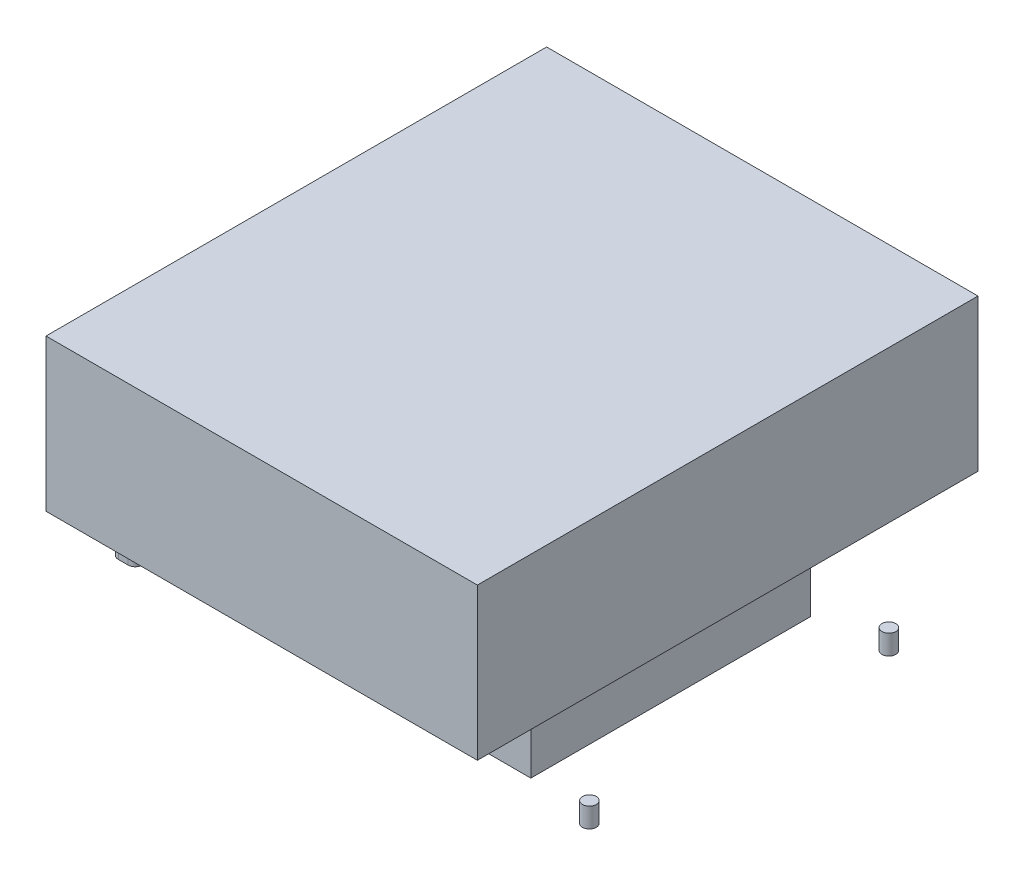
ISO-10303-21;
HEADER;
FILE_DESCRIPTION(('STEP AP214'),'2;1');
FILE_NAME('part.step','',(''),(''),'','','');
FILE_SCHEMA(('AUTOMOTIVE_DESIGN { 1 0 10303 214 1 1 1 1 }'));
ENDSEC;
DATA;
#1=APPLICATION_CONTEXT('core data for automotive mechanical design processes');
#2=APPLICATION_PROTOCOL_DEFINITION('international standard','automotive_design',2000,#1);
#3=PRODUCT_CONTEXT('',#1,'mechanical');
#4=PRODUCT('Part','Part','',(#3));
#5=PRODUCT_RELATED_PRODUCT_CATEGORY('part','',(#4));
#6=PRODUCT_DEFINITION_FORMATION('','',#4);
#7=PRODUCT_DEFINITION_CONTEXT('part definition',#1,'design');
#8=PRODUCT_DEFINITION('design','',#6,#7);
#9=PRODUCT_DEFINITION_SHAPE('','',#8);
#10=(LENGTH_UNIT() NAMED_UNIT(*) SI_UNIT(.MILLI.,.METRE.));
#11=(NAMED_UNIT(*) PLANE_ANGLE_UNIT() SI_UNIT($,.RADIAN.));
#12=(NAMED_UNIT(*) SI_UNIT($,.STERADIAN.) SOLID_ANGLE_UNIT());
#13=UNCERTAINTY_MEASURE_WITH_UNIT(LENGTH_MEASURE(1.E-05),#10,'distance_accuracy_value','');
#14=(GEOMETRIC_REPRESENTATION_CONTEXT(3) GLOBAL_UNCERTAINTY_ASSIGNED_CONTEXT((#13)) GLOBAL_UNIT_ASSIGNED_CONTEXT((#10,
#11,#12)) REPRESENTATION_CONTEXT('',''));
#15=CARTESIAN_POINT('',(0.,0.,0.));
#16=DIRECTION('',(0.,0.,1.));
#17=DIRECTION('',(1.,0.,0.));
#18=AXIS2_PLACEMENT_3D('',#15,#16,#17);
#19=CARTESIAN_POINT('',(114.5,10.,-75.5));
#20=DIRECTION('',(0.,-1.,0.));
#21=DIRECTION('',(0.,0.,-1.));
#22=AXIS2_PLACEMENT_3D('',#19,#20,#21);
#23=CYLINDRICAL_SURFACE('',#22,3.50000000000001);
#24=CARTESIAN_POINT('',(114.5,10.,-75.5));
#25=DIRECTION('',(0.,1.,0.));
#26=DIRECTION('',(0.,0.,1.));
#27=AXIS2_PLACEMENT_3D('',#24,#25,#26);
#28=CIRCLE('',#27,3.50000000000001);
#29=CARTESIAN_POINT('',(114.5,10.,-72.));
#30=VERTEX_POINT('',#29);
#31=EDGE_CURVE('E58',#30,#30,#28,.T.);
#32=ORIENTED_EDGE('',*,*,#31,.F.);
#33=EDGE_LOOP('',(#32));
#34=FACE_BOUND('',#33,.T.);
#35=CARTESIAN_POINT('',(114.5,0.,-75.5));
#36=DIRECTION('',(0.,1.,0.));
#37=DIRECTION('',(0.,0.,1.));
#38=AXIS2_PLACEMENT_3D('',#35,#36,#37);
#39=CIRCLE('',#38,3.50000000000001);
#40=CARTESIAN_POINT('',(114.5,0.,-72.));
#41=VERTEX_POINT('',#40);
#42=EDGE_CURVE('E11',#41,#41,#39,.T.);
#43=ORIENTED_EDGE('',*,*,#42,.T.);
#44=EDGE_LOOP('',(#43));
#45=FACE_BOUND('',#44,.T.);
#46=ADVANCED_FACE('F54',(#34,#45),#23,.T.);
#47=CARTESIAN_POINT('',(114.5,10.,-75.5));
#48=DIRECTION('',(0.,1.,0.));
#49=DIRECTION('',(0.,0.,1.));
#50=AXIS2_PLACEMENT_3D('',#47,#48,#49);
#51=PLANE('',#50);
#52=ORIENTED_EDGE('',*,*,#31,.T.);
#53=EDGE_LOOP('',(#52));
#54=FACE_BOUND('',#53,.T.);
#55=ADVANCED_FACE('F56',(#54),#51,.T.);
#56=CARTESIAN_POINT('',(114.5,0.,-75.5));
#57=DIRECTION('',(0.,1.,0.));
#58=DIRECTION('',(0.,0.,1.));
#59=AXIS2_PLACEMENT_3D('',#56,#57,#58);
#60=PLANE('',#59);
#61=ORIENTED_EDGE('',*,*,#42,.F.);
#62=EDGE_LOOP('',(#61));
#63=FACE_BOUND('',#62,.T.);
#64=ADVANCED_FACE('F73',(#63),#60,.F.);
#65=CLOSED_SHELL('',(#46,#55,#64));
#66=MANIFOLD_SOLID_BREP('B2',#65);
#67=CARTESIAN_POINT('',(114.499999999987,10.,75.5000000000007));
#68=DIRECTION('',(0.,-1.,0.));
#69=DIRECTION('',(0.,0.,-1.));
#70=AXIS2_PLACEMENT_3D('',#67,#68,#69);
#71=CYLINDRICAL_SURFACE('',#70,3.50000000001229);
#72=CARTESIAN_POINT('',(114.499999999987,10.,75.5000000000007));
#73=DIRECTION('',(0.,1.,0.));
#74=DIRECTION('',(0.,0.,1.));
#75=AXIS2_PLACEMENT_3D('',#72,#73,#74);
#76=CIRCLE('',#75,3.50000000001229);
#77=CARTESIAN_POINT('',(114.499999999987,10.,79.000000000013));
#78=VERTEX_POINT('',#77);
#79=EDGE_CURVE('E109',#78,#78,#76,.T.);
#80=ORIENTED_EDGE('',*,*,#79,.F.);
#81=EDGE_LOOP('',(#80));
#82=FACE_BOUND('',#81,.T.);
#83=CARTESIAN_POINT('',(114.499999999987,0.,75.5000000000007));
#84=DIRECTION('',(0.,1.,0.));
#85=DIRECTION('',(0.,0.,1.));
#86=AXIS2_PLACEMENT_3D('',#83,#84,#85);
#87=CIRCLE('',#86,3.50000000001229);
#88=CARTESIAN_POINT('',(114.499999999987,0.,79.000000000013));
#89=VERTEX_POINT('',#88);
#90=EDGE_CURVE('E53',#89,#89,#87,.T.);
#91=ORIENTED_EDGE('',*,*,#90,.T.);
#92=EDGE_LOOP('',(#91));
#93=FACE_BOUND('',#92,.T.);
#94=ADVANCED_FACE('F105',(#82,#93),#71,.T.);
#95=CARTESIAN_POINT('',(0.,10.,0.));
#96=DIRECTION('',(0.,1.,0.));
#97=DIRECTION('',(0.,0.,1.));
#98=AXIS2_PLACEMENT_3D('',#95,#96,#97);
#99=PLANE('',#98);
#100=ORIENTED_EDGE('',*,*,#79,.T.);
#101=EDGE_LOOP('',(#100));
#102=FACE_BOUND('',#101,.T.);
#103=ADVANCED_FACE('F107',(#102),#99,.T.);
#104=CARTESIAN_POINT('',(0.,0.,0.));
#105=DIRECTION('',(0.,1.,0.));
#106=DIRECTION('',(0.,0.,1.));
#107=AXIS2_PLACEMENT_3D('',#104,#105,#106);
#108=PLANE('',#107);
#109=ORIENTED_EDGE('',*,*,#90,.F.);
#110=EDGE_LOOP('',(#109));
#111=FACE_BOUND('',#110,.T.);
#112=ADVANCED_FACE('F124',(#111),#108,.F.);
#113=CLOSED_SHELL('',(#94,#103,#112));
#114=MANIFOLD_SOLID_BREP('B6',#113);
#115=CARTESIAN_POINT('',(-114.499999163765,10.,75.5));
#116=DIRECTION('',(0.,-1.,0.));
#117=DIRECTION('',(0.,0.,-1.));
#118=AXIS2_PLACEMENT_3D('',#115,#116,#117);
#119=CYLINDRICAL_SURFACE('',#118,3.49999999999999);
#120=CARTESIAN_POINT('',(-114.499999163765,0.,75.5));
#121=DIRECTION('',(0.,1.,0.));
#122=DIRECTION('',(0.,0.,1.));
#123=AXIS2_PLACEMENT_3D('',#120,#121,#122);
#124=CIRCLE('',#123,3.49999999999999);
#125=CARTESIAN_POINT('',(-114.499999163765,0.,72.));
#126=VERTEX_POINT('',#125);
#127=CARTESIAN_POINT('',(-114.499999163765,0.,79.));
#128=VERTEX_POINT('',#127);
#129=EDGE_CURVE('E103',#126,#128,#124,.F.);
#130=ORIENTED_EDGE('',*,*,#129,.F.);
#131=DIRECTION('',(0.,-1.,0.));
#132=VECTOR('',#131,1.);
#133=CARTESIAN_POINT('',(-114.499999163765,10.,72.));
#134=LINE('',#133,#132);
#135=CARTESIAN_POINT('',(-114.499999163765,10.,72.));
#136=VERTEX_POINT('',#135);
#137=EDGE_CURVE('E175',#136,#126,#134,.T.);
#138=ORIENTED_EDGE('',*,*,#137,.F.);
#139=CARTESIAN_POINT('',(-114.499999163765,10.,75.5));
#140=DIRECTION('',(0.,1.,0.));
#141=DIRECTION('',(0.,0.,1.));
#142=AXIS2_PLACEMENT_3D('',#139,#140,#141);
#143=CIRCLE('',#142,3.49999999999999);
#144=CARTESIAN_POINT('',(-114.499999163765,10.,79.));
#145=VERTEX_POINT('',#144);
#146=EDGE_CURVE('E160',#136,#145,#143,.F.);
#147=ORIENTED_EDGE('',*,*,#146,.T.);
#148=DIRECTION('',(0.,-1.,0.));
#149=VECTOR('',#148,1.);
#150=CARTESIAN_POINT('',(-114.499999163765,10.,79.));
#151=LINE('',#150,#149);
#152=EDGE_CURVE('E198',#145,#128,#151,.T.);
#153=ORIENTED_EDGE('',*,*,#152,.T.);
#154=EDGE_LOOP('',(#130,#138,#147,#153));
#155=FACE_BOUND('',#154,.T.);
#156=ADVANCED_FACE('F156',(#155),#119,.T.);
#157=CARTESIAN_POINT('',(1.99840144432527E-13,10.,71.9999999999997));
#158=DIRECTION('',(0.,0.,-1.));
#159=DIRECTION('',(-1.,0.,0.));
#160=AXIS2_PLACEMENT_3D('',#157,#158,#159);
#161=PLANE('',#160);
#162=DIRECTION('',(1.,0.,0.));
#163=VECTOR('',#162,1.);
#164=CARTESIAN_POINT('',(1.99840144432527E-13,0.,71.9999999999997));
#165=LINE('',#164,#163);
#166=CARTESIAN_POINT('',(-119.499999163765,0.,72.));
#167=VERTEX_POINT('',#166);
#168=EDGE_CURVE('E166',#167,#126,#165,.T.);
#169=ORIENTED_EDGE('',*,*,#168,.F.);
#170=DIRECTION('',(0.,-1.,0.));
#171=VECTOR('',#170,1.);
#172=CARTESIAN_POINT('',(-119.499999163765,10.,72.));
#173=LINE('',#172,#171);
#174=CARTESIAN_POINT('',(-119.499999163765,10.,72.));
#175=VERTEX_POINT('',#174);
#176=EDGE_CURVE('E189',#175,#167,#173,.T.);
#177=ORIENTED_EDGE('',*,*,#176,.F.);
#178=DIRECTION('',(1.,0.,0.));
#179=VECTOR('',#178,1.);
#180=CARTESIAN_POINT('',(1.99840144432527E-13,10.,71.9999999999997));
#181=LINE('',#180,#179);
#182=EDGE_CURVE('E220',#175,#136,#181,.T.);
#183=ORIENTED_EDGE('',*,*,#182,.T.);
#184=ORIENTED_EDGE('',*,*,#137,.T.);
#185=EDGE_LOOP('',(#169,#177,#183,#184));
#186=FACE_BOUND('',#185,.T.);
#187=ADVANCED_FACE('F227',(#186),#161,.T.);
#188=CARTESIAN_POINT('',(-119.499998974379,10.,75.5000000000007));
#189=DIRECTION('',(0.,-1.,0.));
#190=DIRECTION('',(0.,0.,-1.));
#191=AXIS2_PLACEMENT_3D('',#188,#189,#190);
#192=CYLINDRICAL_SURFACE('',#191,3.5);
#193=CARTESIAN_POINT('',(-119.499998974379,0.,75.5000000000007));
#194=DIRECTION('',(0.,1.,0.));
#195=DIRECTION('',(0.,0.,1.));
#196=AXIS2_PLACEMENT_3D('',#193,#194,#195);
#197=CIRCLE('',#196,3.5);
#198=CARTESIAN_POINT('',(-119.499999163765,0.,79.));
#199=VERTEX_POINT('',#198);
#200=EDGE_CURVE('E204',#167,#199,#197,.T.);
#201=ORIENTED_EDGE('',*,*,#200,.T.);
#202=DIRECTION('',(0.,-1.,0.));
#203=VECTOR('',#202,1.);
#204=CARTESIAN_POINT('',(-119.499999163765,10.,79.));
#205=LINE('',#204,#203);
#206=CARTESIAN_POINT('',(-119.499999163765,10.,79.));
#207=VERTEX_POINT('',#206);
#208=EDGE_CURVE('E207',#207,#199,#205,.T.);
#209=ORIENTED_EDGE('',*,*,#208,.F.);
#210=CARTESIAN_POINT('',(-119.499998974379,10.,75.5000000000007));
#211=DIRECTION('',(0.,1.,0.));
#212=DIRECTION('',(0.,0.,1.));
#213=AXIS2_PLACEMENT_3D('',#210,#211,#212);
#214=CIRCLE('',#213,3.5);
#215=EDGE_CURVE('E225',#175,#207,#214,.T.);
#216=ORIENTED_EDGE('',*,*,#215,.F.);
#217=ORIENTED_EDGE('',*,*,#176,.T.);
#218=EDGE_LOOP('',(#201,#209,#216,#217));
#219=FACE_BOUND('',#218,.T.);
#220=ADVANCED_FACE('F206',(#219),#192,.T.);
#221=CARTESIAN_POINT('',(4.38538094726933E-13,10.,78.9999999999993));
#222=DIRECTION('',(0.,0.,-1.));
#223=DIRECTION('',(-1.,0.,0.));
#224=AXIS2_PLACEMENT_3D('',#221,#222,#223);
#225=PLANE('',#224);
#226=DIRECTION('',(1.,0.,0.));
#227=VECTOR('',#226,1.);
#228=CARTESIAN_POINT('',(4.38538094726933E-13,0.,78.9999999999993));
#229=LINE('',#228,#227);
#230=EDGE_CURVE('E212',#199,#128,#229,.T.);
#231=ORIENTED_EDGE('',*,*,#230,.T.);
#232=ORIENTED_EDGE('',*,*,#152,.F.);
#233=DIRECTION('',(1.,0.,0.));
#234=VECTOR('',#233,1.);
#235=CARTESIAN_POINT('',(4.38538094726933E-13,10.,78.9999999999993));
#236=LINE('',#235,#234);
#237=EDGE_CURVE('E216',#207,#145,#236,.T.);
#238=ORIENTED_EDGE('',*,*,#237,.F.);
#239=ORIENTED_EDGE('',*,*,#208,.T.);
#240=EDGE_LOOP('',(#231,#232,#238,#239));
#241=FACE_BOUND('',#240,.T.);
#242=ADVANCED_FACE('F215',(#241),#225,.F.);
#243=CARTESIAN_POINT('',(0.,10.,0.));
#244=DIRECTION('',(0.,1.,0.));
#245=DIRECTION('',(0.,0.,1.));
#246=AXIS2_PLACEMENT_3D('',#243,#244,#245);
#247=PLANE('',#246);
#248=ORIENTED_EDGE('',*,*,#146,.F.);
#249=ORIENTED_EDGE('',*,*,#182,.F.);
#250=ORIENTED_EDGE('',*,*,#215,.T.);
#251=ORIENTED_EDGE('',*,*,#237,.T.);
#252=EDGE_LOOP('',(#248,#249,#250,#251));
#253=FACE_BOUND('',#252,.T.);
#254=ADVANCED_FACE('F158',(#253),#247,.T.);
#255=CARTESIAN_POINT('',(0.,0.,0.));
#256=DIRECTION('',(0.,1.,0.));
#257=DIRECTION('',(0.,0.,1.));
#258=AXIS2_PLACEMENT_3D('',#255,#256,#257);
#259=PLANE('',#258);
#260=ORIENTED_EDGE('',*,*,#129,.T.);
#261=ORIENTED_EDGE('',*,*,#230,.F.);
#262=ORIENTED_EDGE('',*,*,#200,.F.);
#263=ORIENTED_EDGE('',*,*,#168,.T.);
#264=EDGE_LOOP('',(#260,#261,#262,#263));
#265=FACE_BOUND('',#264,.T.);
#266=ADVANCED_FACE('F218',(#265),#259,.F.);
#267=CLOSED_SHELL('',(#156,#187,#220,#242,#254,#266));
#268=MANIFOLD_SOLID_BREP('B48',#267);
#269=CARTESIAN_POINT('',(-114.5,10.,-75.5000000000007));
#270=DIRECTION('',(0.,-1.,0.));
#271=DIRECTION('',(0.,0.,-1.));
#272=AXIS2_PLACEMENT_3D('',#269,#270,#271);
#273=CYLINDRICAL_SURFACE('',#272,3.49999999999998);
#274=CARTESIAN_POINT('',(-114.5,0.,-75.5000000000007));
#275=DIRECTION('',(0.,1.,0.));
#276=DIRECTION('',(0.,0.,1.));
#277=AXIS2_PLACEMENT_3D('',#274,#275,#276);
#278=CIRCLE('',#277,3.49999999999998);
#279=CARTESIAN_POINT('',(-114.5,0.,-79.0000000000007));
#280=VERTEX_POINT('',#279);
#281=CARTESIAN_POINT('',(-114.5,0.,-72.0000000000007));
#282=VERTEX_POINT('',#281);
#283=EDGE_CURVE('E352',#280,#282,#278,.F.);
#284=ORIENTED_EDGE('',*,*,#283,.F.);
#285=DIRECTION('',(0.,-1.,0.));
#286=VECTOR('',#285,1.);
#287=CARTESIAN_POINT('',(-114.5,10.,-79.0000000000007));
#288=LINE('',#287,#286);
#289=CARTESIAN_POINT('',(-114.5,10.,-79.0000000000007));
#290=VERTEX_POINT('',#289);
#291=EDGE_CURVE('E154',#290,#280,#288,.T.);
#292=ORIENTED_EDGE('',*,*,#291,.F.);
#293=CARTESIAN_POINT('',(-114.5,10.,-75.5000000000007));
#294=DIRECTION('',(0.,1.,0.));
#295=DIRECTION('',(0.,0.,1.));
#296=AXIS2_PLACEMENT_3D('',#293,#294,#295);
#297=CIRCLE('',#296,3.49999999999998);
#298=CARTESIAN_POINT('',(-114.5,10.,-72.0000000000007));
#299=VERTEX_POINT('',#298);
#300=EDGE_CURVE('E346',#290,#299,#297,.F.);
#301=ORIENTED_EDGE('',*,*,#300,.T.);
#302=DIRECTION('',(0.,-1.,0.));
#303=VECTOR('',#302,1.);
#304=CARTESIAN_POINT('',(-114.5,10.,-72.0000000000007));
#305=LINE('',#304,#303);
#306=EDGE_CURVE('E327',#299,#282,#305,.T.);
#307=ORIENTED_EDGE('',*,*,#306,.T.);
#308=EDGE_LOOP('',(#284,#292,#301,#307));
#309=FACE_BOUND('',#308,.T.);
#310=ADVANCED_FACE('F289',(#309),#273,.T.);
#311=CARTESIAN_POINT('',(-2.19269047363471E-13,10.,-79.000000000001));
#312=DIRECTION('',(0.,0.,-1.));
#313=DIRECTION('',(-1.,0.,0.));
#314=AXIS2_PLACEMENT_3D('',#311,#312,#313);
#315=PLANE('',#314);
#316=DIRECTION('',(1.,0.,0.));
#317=VECTOR('',#316,1.);
#318=CARTESIAN_POINT('',(-2.19269047363471E-13,0.,-79.000000000001));
#319=LINE('',#318,#317);
#320=CARTESIAN_POINT('',(-119.5,0.,-79.0000000000006));
#321=VERTEX_POINT('',#320);
#322=EDGE_CURVE('E340',#321,#280,#319,.T.);
#323=ORIENTED_EDGE('',*,*,#322,.F.);
#324=DIRECTION('',(0.,-1.,0.));
#325=VECTOR('',#324,1.);
#326=CARTESIAN_POINT('',(-119.5,10.,-79.0000000000006));
#327=LINE('',#326,#325);
#328=CARTESIAN_POINT('',(-119.5,10.,-79.0000000000006));
#329=VERTEX_POINT('',#328);
#330=EDGE_CURVE('E297',#329,#321,#327,.T.);
#331=ORIENTED_EDGE('',*,*,#330,.F.);
#332=DIRECTION('',(1.,0.,0.));
#333=VECTOR('',#332,1.);
#334=CARTESIAN_POINT('',(-2.19269047363471E-13,10.,-79.000000000001));
#335=LINE('',#334,#333);
#336=EDGE_CURVE('E338',#329,#290,#335,.T.);
#337=ORIENTED_EDGE('',*,*,#336,.T.);
#338=ORIENTED_EDGE('',*,*,#291,.T.);
#339=EDGE_LOOP('',(#323,#331,#337,#338));
#340=FACE_BOUND('',#339,.T.);
#341=ADVANCED_FACE('F336',(#340),#315,.T.);
#342=CARTESIAN_POINT('',(-119.499998138144,10.,-75.5000000000005));
#343=DIRECTION('',(0.,-1.,0.));
#344=DIRECTION('',(0.,0.,-1.));
#345=AXIS2_PLACEMENT_3D('',#342,#343,#344);
#346=CYLINDRICAL_SURFACE('',#345,3.50000000000046);
#347=CARTESIAN_POINT('',(-119.499998138144,0.,-75.5000000000005));
#348=DIRECTION('',(0.,1.,0.));
#349=DIRECTION('',(0.,0.,1.));
#350=AXIS2_PLACEMENT_3D('',#347,#348,#349);
#351=CIRCLE('',#350,3.50000000000046);
#352=CARTESIAN_POINT('',(-119.5,0.,-72.0000000000007));
#353=VERTEX_POINT('',#352);
#354=EDGE_CURVE('E320',#321,#353,#351,.T.);
#355=ORIENTED_EDGE('',*,*,#354,.T.);
#356=DIRECTION('',(0.,-1.,0.));
#357=VECTOR('',#356,1.);
#358=CARTESIAN_POINT('',(-119.5,10.,-72.0000000000007));
#359=LINE('',#358,#357);
#360=CARTESIAN_POINT('',(-119.5,10.,-72.0000000000007));
#361=VERTEX_POINT('',#360);
#362=EDGE_CURVE('E341',#361,#353,#359,.T.);
#363=ORIENTED_EDGE('',*,*,#362,.F.);
#364=CARTESIAN_POINT('',(-119.499998138144,10.,-75.5000000000005));
#365=DIRECTION('',(0.,1.,0.));
#366=DIRECTION('',(0.,0.,1.));
#367=AXIS2_PLACEMENT_3D('',#364,#365,#366);
#368=CIRCLE('',#367,3.50000000000046);
#369=EDGE_CURVE('E342',#329,#361,#368,.T.);
#370=ORIENTED_EDGE('',*,*,#369,.F.);
#371=ORIENTED_EDGE('',*,*,#330,.T.);
#372=EDGE_LOOP('',(#355,#363,#370,#371));
#373=FACE_BOUND('',#372,.T.);
#374=ADVANCED_FACE('F343',(#373),#346,.T.);
#375=CARTESIAN_POINT('',(1.99840144432526E-13,10.,-72.0000000000004));
#376=DIRECTION('',(0.,0.,-1.));
#377=DIRECTION('',(-1.,0.,0.));
#378=AXIS2_PLACEMENT_3D('',#375,#376,#377);
#379=PLANE('',#378);
#380=DIRECTION('',(1.,0.,0.));
#381=VECTOR('',#380,1.);
#382=CARTESIAN_POINT('',(1.99840144432526E-13,0.,-72.0000000000004));
#383=LINE('',#382,#381);
#384=EDGE_CURVE('E348',#353,#282,#383,.T.);
#385=ORIENTED_EDGE('',*,*,#384,.T.);
#386=ORIENTED_EDGE('',*,*,#306,.F.);
#387=DIRECTION('',(1.,0.,0.));
#388=VECTOR('',#387,1.);
#389=CARTESIAN_POINT('',(1.99840144432526E-13,10.,-72.0000000000004));
#390=LINE('',#389,#388);
#391=EDGE_CURVE('E305',#361,#299,#390,.T.);
#392=ORIENTED_EDGE('',*,*,#391,.F.);
#393=ORIENTED_EDGE('',*,*,#362,.T.);
#394=EDGE_LOOP('',(#385,#386,#392,#393));
#395=FACE_BOUND('',#394,.T.);
#396=ADVANCED_FACE('F361',(#395),#379,.F.);
#397=CARTESIAN_POINT('',(0.,10.,0.));
#398=DIRECTION('',(0.,1.,0.));
#399=DIRECTION('',(0.,0.,1.));
#400=AXIS2_PLACEMENT_3D('',#397,#398,#399);
#401=PLANE('',#400);
#402=ORIENTED_EDGE('',*,*,#300,.F.);
#403=ORIENTED_EDGE('',*,*,#336,.F.);
#404=ORIENTED_EDGE('',*,*,#369,.T.);
#405=ORIENTED_EDGE('',*,*,#391,.T.);
#406=EDGE_LOOP('',(#402,#403,#404,#405));
#407=FACE_BOUND('',#406,.T.);
#408=ADVANCED_FACE('F345',(#407),#401,.T.);
#409=CARTESIAN_POINT('',(0.,0.,0.));
#410=DIRECTION('',(0.,1.,0.));
#411=DIRECTION('',(0.,0.,1.));
#412=AXIS2_PLACEMENT_3D('',#409,#410,#411);
#413=PLANE('',#412);
#414=ORIENTED_EDGE('',*,*,#283,.T.);
#415=ORIENTED_EDGE('',*,*,#384,.F.);
#416=ORIENTED_EDGE('',*,*,#354,.F.);
#417=ORIENTED_EDGE('',*,*,#322,.T.);
#418=EDGE_LOOP('',(#414,#415,#416,#417));
#419=FACE_BOUND('',#418,.T.);
#420=ADVANCED_FACE('F363',(#419),#413,.F.);
#421=CLOSED_SHELL('',(#310,#341,#374,#396,#408,#420));
#422=MANIFOLD_SOLID_BREP('B97',#421);
#423=CARTESIAN_POINT('',(0.,50.,70.5));
#424=DIRECTION('',(0.,0.,-1.));
#425=DIRECTION('',(-1.,0.,0.));
#426=AXIS2_PLACEMENT_3D('',#423,#424,#425);
#427=PLANE('',#426);
#428=DIRECTION('',(1.,0.,0.));
#429=VECTOR('',#428,1.);
#430=CARTESIAN_POINT('',(0.,0.,70.5));
#431=LINE('',#430,#429);
#432=CARTESIAN_POINT('',(-80.,0.,70.5));
#433=VERTEX_POINT('',#432);
#434=CARTESIAN_POINT('',(80.,0.,70.5));
#435=VERTEX_POINT('',#434);
#436=EDGE_CURVE('E469',#433,#435,#431,.T.);
#437=ORIENTED_EDGE('',*,*,#436,.T.);
#438=DIRECTION('',(0.,-1.,0.));
#439=VECTOR('',#438,1.);
#440=CARTESIAN_POINT('',(80.,50.,70.5));
#441=LINE('',#440,#439);
#442=CARTESIAN_POINT('',(80.,50.,70.5));
#443=VERTEX_POINT('',#442);
#444=EDGE_CURVE('E287',#443,#435,#441,.T.);
#445=ORIENTED_EDGE('',*,*,#444,.F.);
#446=DIRECTION('',(1.,0.,0.));
#447=VECTOR('',#446,1.);
#448=CARTESIAN_POINT('',(0.,50.,70.5));
#449=LINE('',#448,#447);
#450=CARTESIAN_POINT('',(-80.,50.,70.5));
#451=VERTEX_POINT('',#450);
#452=EDGE_CURVE('E471',#451,#443,#449,.T.);
#453=ORIENTED_EDGE('',*,*,#452,.F.);
#454=DIRECTION('',(0.,-1.,0.));
#455=VECTOR('',#454,1.);
#456=CARTESIAN_POINT('',(-80.,50.,70.5));
#457=LINE('',#456,#455);
#458=EDGE_CURVE('E455',#451,#433,#457,.T.);
#459=ORIENTED_EDGE('',*,*,#458,.T.);
#460=EDGE_LOOP('',(#437,#445,#453,#459));
#461=FACE_BOUND('',#460,.T.);
#462=ADVANCED_FACE('F413',(#461),#427,.F.);
#463=CARTESIAN_POINT('',(80.,50.,0.));
#464=DIRECTION('',(-1.,0.,0.));
#465=DIRECTION('',(0.,0.,1.));
#466=AXIS2_PLACEMENT_3D('',#463,#464,#465);
#467=PLANE('',#466);
#468=DIRECTION('',(0.,0.,-1.));
#469=VECTOR('',#468,1.);
#470=CARTESIAN_POINT('',(80.,0.,0.));
#471=LINE('',#470,#469);
#472=CARTESIAN_POINT('',(80.,0.,-70.5));
#473=VERTEX_POINT('',#472);
#474=EDGE_CURVE('E464',#435,#473,#471,.T.);
#475=ORIENTED_EDGE('',*,*,#474,.T.);
#476=DIRECTION('',(0.,-1.,0.));
#477=VECTOR('',#476,1.);
#478=CARTESIAN_POINT('',(80.,50.,-70.5));
#479=LINE('',#478,#477);
#480=CARTESIAN_POINT('',(80.,50.,-70.5));
#481=VERTEX_POINT('',#480);
#482=EDGE_CURVE('E422',#481,#473,#479,.T.);
#483=ORIENTED_EDGE('',*,*,#482,.F.);
#484=DIRECTION('',(0.,0.,-1.));
#485=VECTOR('',#484,1.);
#486=CARTESIAN_POINT('',(80.,50.,0.));
#487=LINE('',#486,#485);
#488=EDGE_CURVE('E475',#443,#481,#487,.T.);
#489=ORIENTED_EDGE('',*,*,#488,.F.);
#490=ORIENTED_EDGE('',*,*,#444,.T.);
#491=EDGE_LOOP('',(#475,#483,#489,#490));
#492=FACE_BOUND('',#491,.T.);
#493=ADVANCED_FACE('F495',(#492),#467,.F.);
#494=CARTESIAN_POINT('',(0.,50.,-70.5));
#495=DIRECTION('',(0.,0.,-1.));
#496=DIRECTION('',(-1.,0.,0.));
#497=AXIS2_PLACEMENT_3D('',#494,#495,#496);
#498=PLANE('',#497);
#499=DIRECTION('',(1.,0.,0.));
#500=VECTOR('',#499,1.);
#501=CARTESIAN_POINT('',(0.,0.,-70.5));
#502=LINE('',#501,#500);
#503=CARTESIAN_POINT('',(-80.,0.,-70.5));
#504=VERTEX_POINT('',#503);
#505=EDGE_CURVE('E458',#504,#473,#502,.T.);
#506=ORIENTED_EDGE('',*,*,#505,.F.);
#507=DIRECTION('',(0.,-1.,0.));
#508=VECTOR('',#507,1.);
#509=CARTESIAN_POINT('',(-80.,50.,-70.5));
#510=LINE('',#509,#508);
#511=CARTESIAN_POINT('',(-80.,50.,-70.5));
#512=VERTEX_POINT('',#511);
#513=EDGE_CURVE('E446',#512,#504,#510,.T.);
#514=ORIENTED_EDGE('',*,*,#513,.F.);
#515=DIRECTION('',(1.,0.,0.));
#516=VECTOR('',#515,1.);
#517=CARTESIAN_POINT('',(0.,50.,-70.5));
#518=LINE('',#517,#516);
#519=EDGE_CURVE('E429',#512,#481,#518,.T.);
#520=ORIENTED_EDGE('',*,*,#519,.T.);
#521=ORIENTED_EDGE('',*,*,#482,.T.);
#522=EDGE_LOOP('',(#506,#514,#520,#521));
#523=FACE_BOUND('',#522,.T.);
#524=ADVANCED_FACE('F459',(#523),#498,.T.);
#525=CARTESIAN_POINT('',(-80.,50.,0.));
#526=DIRECTION('',(-1.,0.,0.));
#527=DIRECTION('',(0.,0.,1.));
#528=AXIS2_PLACEMENT_3D('',#525,#526,#527);
#529=PLANE('',#528);
#530=DIRECTION('',(0.,0.,-1.));
#531=VECTOR('',#530,1.);
#532=CARTESIAN_POINT('',(-80.,0.,0.));
#533=LINE('',#532,#531);
#534=EDGE_CURVE('E451',#433,#504,#533,.T.);
#535=ORIENTED_EDGE('',*,*,#534,.F.);
#536=ORIENTED_EDGE('',*,*,#458,.F.);
#537=DIRECTION('',(0.,0.,-1.));
#538=VECTOR('',#537,1.);
#539=CARTESIAN_POINT('',(-80.,50.,0.));
#540=LINE('',#539,#538);
#541=EDGE_CURVE('E452',#451,#512,#540,.T.);
#542=ORIENTED_EDGE('',*,*,#541,.T.);
#543=ORIENTED_EDGE('',*,*,#513,.T.);
#544=EDGE_LOOP('',(#535,#536,#542,#543));
#545=FACE_BOUND('',#544,.T.);
#546=ADVANCED_FACE('F448',(#545),#529,.T.);
#547=CARTESIAN_POINT('',(0.,0.,0.));
#548=DIRECTION('',(0.,1.,0.));
#549=DIRECTION('',(0.,0.,1.));
#550=AXIS2_PLACEMENT_3D('',#547,#548,#549);
#551=PLANE('',#550);
#552=ORIENTED_EDGE('',*,*,#436,.F.);
#553=ORIENTED_EDGE('',*,*,#534,.T.);
#554=ORIENTED_EDGE('',*,*,#505,.T.);
#555=ORIENTED_EDGE('',*,*,#474,.F.);
#556=EDGE_LOOP('',(#552,#553,#554,#555));
#557=FACE_BOUND('',#556,.T.);
#558=ADVANCED_FACE('F467',(#557),#551,.F.);
#559=CARTESIAN_POINT('',(0.,50.,0.));
#560=DIRECTION('',(0.,1.,0.));
#561=DIRECTION('',(0.,0.,1.));
#562=AXIS2_PLACEMENT_3D('',#559,#560,#561);
#563=PLANE('',#562);
#564=DIRECTION('',(-1.,0.,0.));
#565=VECTOR('',#564,1.);
#566=CARTESIAN_POINT('',(0.,50.,-126.20625));
#567=LINE('',#566,#565);
#568=CARTESIAN_POINT('',(108.74375,50.,-126.20625));
#569=VERTEX_POINT('',#568);
#570=CARTESIAN_POINT('',(-108.74375,50.,-126.20625));
#571=VERTEX_POINT('',#570);
#572=EDGE_CURVE('E553',#569,#571,#567,.T.);
#573=ORIENTED_EDGE('',*,*,#572,.F.);
#574=DIRECTION('',(0.,0.,1.));
#575=VECTOR('',#574,1.);
#576=CARTESIAN_POINT('',(108.74375,50.,0.));
#577=LINE('',#576,#575);
#578=CARTESIAN_POINT('',(108.74375,50.,126.20625));
#579=VERTEX_POINT('',#578);
#580=EDGE_CURVE('E549',#569,#579,#577,.T.);
#581=ORIENTED_EDGE('',*,*,#580,.T.);
#582=DIRECTION('',(-1.,0.,0.));
#583=VECTOR('',#582,1.);
#584=CARTESIAN_POINT('',(0.,50.,126.20625));
#585=LINE('',#584,#583);
#586=CARTESIAN_POINT('',(-108.74375,50.,126.20625));
#587=VERTEX_POINT('',#586);
#588=EDGE_CURVE('E567',#579,#587,#585,.T.);
#589=ORIENTED_EDGE('',*,*,#588,.T.);
#590=DIRECTION('',(0.,0.,1.));
#591=VECTOR('',#590,1.);
#592=CARTESIAN_POINT('',(-108.74375,50.,0.));
#593=LINE('',#592,#591);
#594=EDGE_CURVE('E571',#571,#587,#593,.T.);
#595=ORIENTED_EDGE('',*,*,#594,.F.);
#596=EDGE_LOOP('',(#573,#581,#589,#595));
#597=FACE_BOUND('',#596,.T.);
#598=ORIENTED_EDGE('',*,*,#541,.F.);
#599=ORIENTED_EDGE('',*,*,#452,.T.);
#600=ORIENTED_EDGE('',*,*,#488,.T.);
#601=ORIENTED_EDGE('',*,*,#519,.F.);
#602=EDGE_LOOP('',(#598,#599,#600,#601));
#603=FACE_BOUND('',#602,.T.);
#604=ADVANCED_FACE('F586',(#597,#603),#563,.F.);
#605=CARTESIAN_POINT('',(0.,126.5302,-126.20625));
#606=DIRECTION('',(0.,0.,1.));
#607=DIRECTION('',(1.,0.,0.));
#608=AXIS2_PLACEMENT_3D('',#605,#606,#607);
#609=PLANE('',#608);
#610=ORIENTED_EDGE('',*,*,#572,.T.);
#611=DIRECTION('',(0.,-1.,0.));
#612=VECTOR('',#611,1.);
#613=CARTESIAN_POINT('',(-108.74375,126.5302,-126.20625));
#614=LINE('',#613,#612);
#615=CARTESIAN_POINT('',(-108.74375,126.5302,-126.20625));
#616=VERTEX_POINT('',#615);
#617=EDGE_CURVE('E492',#616,#571,#614,.T.);
#618=ORIENTED_EDGE('',*,*,#617,.F.);
#619=DIRECTION('',(-1.,0.,0.));
#620=VECTOR('',#619,1.);
#621=CARTESIAN_POINT('',(0.,126.5302,-126.20625));
#622=LINE('',#621,#620);
#623=CARTESIAN_POINT('',(108.74375,126.5302,-126.20625));
#624=VERTEX_POINT('',#623);
#625=EDGE_CURVE('E540',#624,#616,#622,.T.);
#626=ORIENTED_EDGE('',*,*,#625,.F.);
#627=DIRECTION('',(0.,-1.,0.));
#628=VECTOR('',#627,1.);
#629=CARTESIAN_POINT('',(108.74375,126.5302,-126.20625));
#630=LINE('',#629,#628);
#631=EDGE_CURVE('E561',#624,#569,#630,.T.);
#632=ORIENTED_EDGE('',*,*,#631,.T.);
#633=EDGE_LOOP('',(#610,#618,#626,#632));
#634=FACE_BOUND('',#633,.T.);
#635=ADVANCED_FACE('F551',(#634),#609,.F.);
#636=CARTESIAN_POINT('',(-108.74375,126.5302,0.));
#637=DIRECTION('',(1.,0.,0.));
#638=DIRECTION('',(0.,0.,-1.));
#639=AXIS2_PLACEMENT_3D('',#636,#637,#638);
#640=PLANE('',#639);
#641=ORIENTED_EDGE('',*,*,#594,.T.);
#642=DIRECTION('',(0.,-1.,0.));
#643=VECTOR('',#642,1.);
#644=CARTESIAN_POINT('',(-108.74375,126.5302,126.20625));
#645=LINE('',#644,#643);
#646=CARTESIAN_POINT('',(-108.74375,126.5302,126.20625));
#647=VERTEX_POINT('',#646);
#648=EDGE_CURVE('E534',#647,#587,#645,.T.);
#649=ORIENTED_EDGE('',*,*,#648,.F.);
#650=DIRECTION('',(0.,0.,1.));
#651=VECTOR('',#650,1.);
#652=CARTESIAN_POINT('',(-108.74375,126.5302,0.));
#653=LINE('',#652,#651);
#654=EDGE_CURVE('E528',#616,#647,#653,.T.);
#655=ORIENTED_EDGE('',*,*,#654,.F.);
#656=ORIENTED_EDGE('',*,*,#617,.T.);
#657=EDGE_LOOP('',(#641,#649,#655,#656));
#658=FACE_BOUND('',#657,.T.);
#659=ADVANCED_FACE('F531',(#658),#640,.F.);
#660=CARTESIAN_POINT('',(0.,126.5302,126.20625));
#661=DIRECTION('',(0.,0.,1.));
#662=DIRECTION('',(1.,0.,0.));
#663=AXIS2_PLACEMENT_3D('',#660,#661,#662);
#664=PLANE('',#663);
#665=ORIENTED_EDGE('',*,*,#588,.F.);
#666=DIRECTION('',(0.,-1.,0.));
#667=VECTOR('',#666,1.);
#668=CARTESIAN_POINT('',(108.74375,126.5302,126.20625));
#669=LINE('',#668,#667);
#670=CARTESIAN_POINT('',(108.74375,126.5302,126.20625));
#671=VERTEX_POINT('',#670);
#672=EDGE_CURVE('E556',#671,#579,#669,.T.);
#673=ORIENTED_EDGE('',*,*,#672,.F.);
#674=DIRECTION('',(-1.,0.,0.));
#675=VECTOR('',#674,1.);
#676=CARTESIAN_POINT('',(0.,126.5302,126.20625));
#677=LINE('',#676,#675);
#678=EDGE_CURVE('E539',#671,#647,#677,.T.);
#679=ORIENTED_EDGE('',*,*,#678,.T.);
#680=ORIENTED_EDGE('',*,*,#648,.T.);
#681=EDGE_LOOP('',(#665,#673,#679,#680));
#682=FACE_BOUND('',#681,.T.);
#683=ADVANCED_FACE('F581',(#682),#664,.T.);
#684=CARTESIAN_POINT('',(108.74375,126.5302,0.));
#685=DIRECTION('',(1.,0.,0.));
#686=DIRECTION('',(0.,0.,-1.));
#687=AXIS2_PLACEMENT_3D('',#684,#685,#686);
#688=PLANE('',#687);
#689=ORIENTED_EDGE('',*,*,#580,.F.);
#690=ORIENTED_EDGE('',*,*,#631,.F.);
#691=DIRECTION('',(0.,0.,1.));
#692=VECTOR('',#691,1.);
#693=CARTESIAN_POINT('',(108.74375,126.5302,0.));
#694=LINE('',#693,#692);
#695=EDGE_CURVE('E546',#624,#671,#694,.T.);
#696=ORIENTED_EDGE('',*,*,#695,.T.);
#697=ORIENTED_EDGE('',*,*,#672,.T.);
#698=EDGE_LOOP('',(#689,#690,#696,#697));
#699=FACE_BOUND('',#698,.T.);
#700=ADVANCED_FACE('F584',(#699),#688,.T.);
#701=CARTESIAN_POINT('',(0.,126.5302,0.));
#702=DIRECTION('',(0.,1.,0.));
#703=DIRECTION('',(0.,0.,1.));
#704=AXIS2_PLACEMENT_3D('',#701,#702,#703);
#705=PLANE('',#704);
#706=ORIENTED_EDGE('',*,*,#625,.T.);
#707=ORIENTED_EDGE('',*,*,#654,.T.);
#708=ORIENTED_EDGE('',*,*,#678,.F.);
#709=ORIENTED_EDGE('',*,*,#695,.F.);
#710=EDGE_LOOP('',(#706,#707,#708,#709));
#711=FACE_BOUND('',#710,.T.);
#712=ADVANCED_FACE('F544',(#711),#705,.T.);
#713=CLOSED_SHELL('',(#462,#493,#524,#546,#558,#604,#635,#659,#683,#700,#712));
#714=MANIFOLD_SOLID_BREP('B148',#713);
#715=ADVANCED_BREP_SHAPE_REPRESENTATION('',(#18,#66,#114,#268,#422,#714),#14);
#716=SHAPE_DEFINITION_REPRESENTATION(#9,#715);
ENDSEC;
END-ISO-10303-21;
